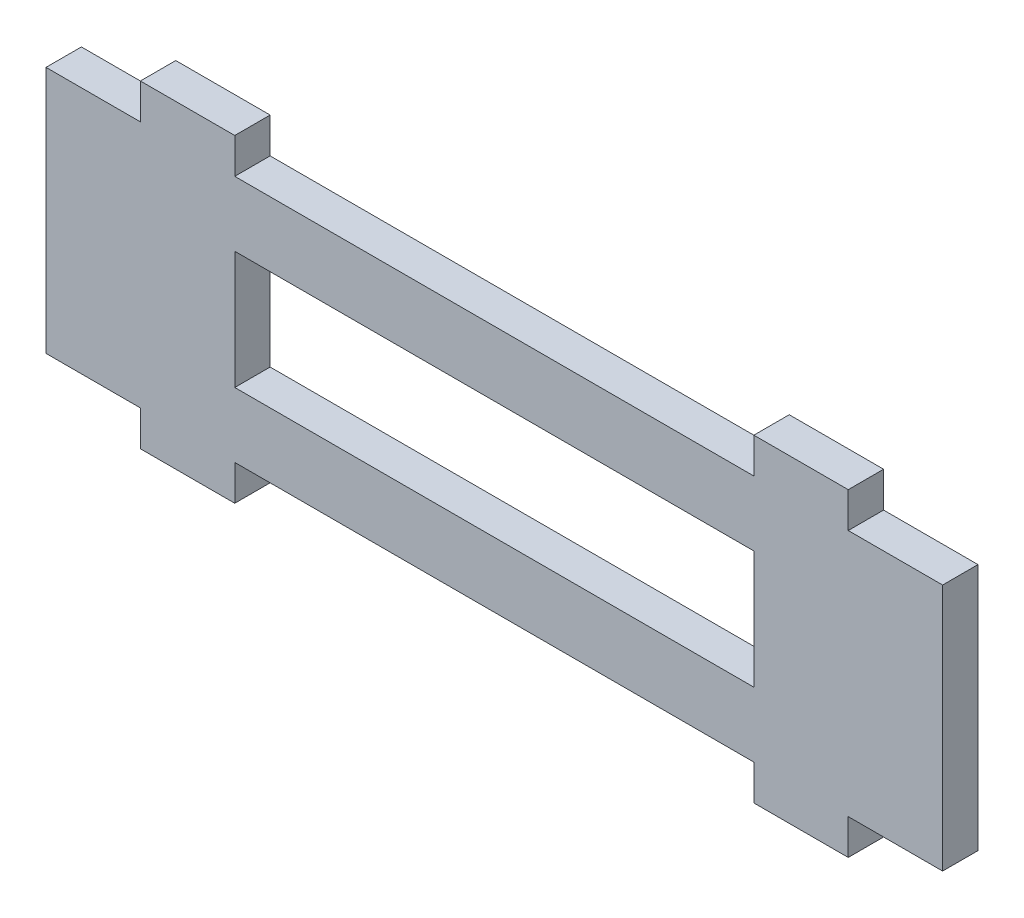
ISO-10303-21;
HEADER;
FILE_DESCRIPTION(('STEP AP214'),'2;1');
FILE_NAME('part.step','',(''),(''),'','','');
FILE_SCHEMA(('AUTOMOTIVE_DESIGN { 1 0 10303 214 1 1 1 1 }'));
ENDSEC;
DATA;
#1=APPLICATION_CONTEXT('core data for automotive mechanical design processes');
#2=APPLICATION_PROTOCOL_DEFINITION('international standard','automotive_design',2000,#1);
#3=PRODUCT_CONTEXT('',#1,'mechanical');
#4=PRODUCT('Part','Part','',(#3));
#5=PRODUCT_RELATED_PRODUCT_CATEGORY('part','',(#4));
#6=PRODUCT_DEFINITION_FORMATION('','',#4);
#7=PRODUCT_DEFINITION_CONTEXT('part definition',#1,'design');
#8=PRODUCT_DEFINITION('design','',#6,#7);
#9=PRODUCT_DEFINITION_SHAPE('','',#8);
#10=(LENGTH_UNIT() NAMED_UNIT(*) SI_UNIT(.MILLI.,.METRE.));
#11=(NAMED_UNIT(*) PLANE_ANGLE_UNIT() SI_UNIT($,.RADIAN.));
#12=(NAMED_UNIT(*) SI_UNIT($,.STERADIAN.) SOLID_ANGLE_UNIT());
#13=UNCERTAINTY_MEASURE_WITH_UNIT(LENGTH_MEASURE(1.E-05),#10,'distance_accuracy_value','');
#14=(GEOMETRIC_REPRESENTATION_CONTEXT(3) GLOBAL_UNCERTAINTY_ASSIGNED_CONTEXT((#13)) GLOBAL_UNIT_ASSIGNED_CONTEXT((#10,
#11,#12)) REPRESENTATION_CONTEXT('',''));
#15=CARTESIAN_POINT('',(0.,0.,0.));
#16=DIRECTION('',(0.,0.,1.));
#17=DIRECTION('',(1.,0.,0.));
#18=AXIS2_PLACEMENT_3D('',#15,#16,#17);
#19=CARTESIAN_POINT('',(0.,0.,3.));
#20=DIRECTION('',(0.,0.,1.));
#21=DIRECTION('',(1.,0.,0.));
#22=AXIS2_PLACEMENT_3D('',#19,#20,#21);
#23=PLANE('',#22);
#24=DIRECTION('',(0.,-1.,0.));
#25=VECTOR('',#24,1.);
#26=CARTESIAN_POINT('',(22.,13.5,3.));
#27=LINE('',#26,#25);
#28=CARTESIAN_POINT('',(22.,13.5,3.));
#29=VERTEX_POINT('',#28);
#30=CARTESIAN_POINT('',(22.,10.5,3.));
#31=VERTEX_POINT('',#30);
#32=EDGE_CURVE('E230',#29,#31,#27,.T.);
#33=ORIENTED_EDGE('',*,*,#32,.T.);
#34=DIRECTION('',(-1.,0.,0.));
#35=VECTOR('',#34,1.);
#36=CARTESIAN_POINT('',(-22.,10.5,3.));
#37=LINE('',#36,#35);
#38=CARTESIAN_POINT('',(-22.,10.5,3.));
#39=VERTEX_POINT('',#38);
#40=EDGE_CURVE('E233',#31,#39,#37,.T.);
#41=ORIENTED_EDGE('',*,*,#40,.T.);
#42=DIRECTION('',(0.,1.,0.));
#43=VECTOR('',#42,1.);
#44=CARTESIAN_POINT('',(-22.,13.5,3.));
#45=LINE('',#44,#43);
#46=CARTESIAN_POINT('',(-22.,13.5,3.));
#47=VERTEX_POINT('',#46);
#48=EDGE_CURVE('E236',#39,#47,#45,.T.);
#49=ORIENTED_EDGE('',*,*,#48,.T.);
#50=DIRECTION('',(-1.,0.,0.));
#51=VECTOR('',#50,1.);
#52=CARTESIAN_POINT('',(-30.,13.5,3.));
#53=LINE('',#52,#51);
#54=CARTESIAN_POINT('',(-30.,13.5,3.));
#55=VERTEX_POINT('',#54);
#56=EDGE_CURVE('E238',#47,#55,#53,.T.);
#57=ORIENTED_EDGE('',*,*,#56,.T.);
#58=DIRECTION('',(0.,-1.,0.));
#59=VECTOR('',#58,1.);
#60=CARTESIAN_POINT('',(-30.,10.5,3.));
#61=LINE('',#60,#59);
#62=CARTESIAN_POINT('',(-30.,10.5,3.));
#63=VERTEX_POINT('',#62);
#64=EDGE_CURVE('E240',#55,#63,#61,.T.);
#65=ORIENTED_EDGE('',*,*,#64,.T.);
#66=DIRECTION('',(-1.,0.,0.));
#67=VECTOR('',#66,1.);
#68=CARTESIAN_POINT('',(-38.,10.5,3.));
#69=LINE('',#68,#67);
#70=CARTESIAN_POINT('',(-38.,10.5,3.));
#71=VERTEX_POINT('',#70);
#72=EDGE_CURVE('E242',#63,#71,#69,.T.);
#73=ORIENTED_EDGE('',*,*,#72,.T.);
#74=DIRECTION('',(0.,-1.,0.));
#75=VECTOR('',#74,1.);
#76=CARTESIAN_POINT('',(-38.,-10.5,3.));
#77=LINE('',#76,#75);
#78=CARTESIAN_POINT('',(-38.,-10.5,3.));
#79=VERTEX_POINT('',#78);
#80=EDGE_CURVE('E244',#71,#79,#77,.T.);
#81=ORIENTED_EDGE('',*,*,#80,.T.);
#82=DIRECTION('',(1.,0.,0.));
#83=VECTOR('',#82,1.);
#84=CARTESIAN_POINT('',(-38.,-10.5,3.));
#85=LINE('',#84,#83);
#86=CARTESIAN_POINT('',(-30.,-10.5,3.));
#87=VERTEX_POINT('',#86);
#88=EDGE_CURVE('E246',#79,#87,#85,.T.);
#89=ORIENTED_EDGE('',*,*,#88,.T.);
#90=DIRECTION('',(0.,-1.,0.));
#91=VECTOR('',#90,1.);
#92=CARTESIAN_POINT('',(-30.,-10.5,3.));
#93=LINE('',#92,#91);
#94=CARTESIAN_POINT('',(-30.,-13.5,3.));
#95=VERTEX_POINT('',#94);
#96=EDGE_CURVE('E248',#87,#95,#93,.T.);
#97=ORIENTED_EDGE('',*,*,#96,.T.);
#98=DIRECTION('',(1.,0.,0.));
#99=VECTOR('',#98,1.);
#100=CARTESIAN_POINT('',(-30.,-13.5,3.));
#101=LINE('',#100,#99);
#102=CARTESIAN_POINT('',(-22.,-13.5,3.));
#103=VERTEX_POINT('',#102);
#104=EDGE_CURVE('E250',#95,#103,#101,.T.);
#105=ORIENTED_EDGE('',*,*,#104,.T.);
#106=DIRECTION('',(0.,1.,0.));
#107=VECTOR('',#106,1.);
#108=CARTESIAN_POINT('',(-22.,-13.5,3.));
#109=LINE('',#108,#107);
#110=CARTESIAN_POINT('',(-22.,-10.5,3.));
#111=VERTEX_POINT('',#110);
#112=EDGE_CURVE('E252',#103,#111,#109,.T.);
#113=ORIENTED_EDGE('',*,*,#112,.T.);
#114=DIRECTION('',(1.,0.,0.));
#115=VECTOR('',#114,1.);
#116=CARTESIAN_POINT('',(-22.,-10.5,3.));
#117=LINE('',#116,#115);
#118=CARTESIAN_POINT('',(22.,-10.5,3.));
#119=VERTEX_POINT('',#118);
#120=EDGE_CURVE('E254',#111,#119,#117,.T.);
#121=ORIENTED_EDGE('',*,*,#120,.T.);
#122=DIRECTION('',(0.,-1.,0.));
#123=VECTOR('',#122,1.);
#124=CARTESIAN_POINT('',(22.,-13.5,3.));
#125=LINE('',#124,#123);
#126=CARTESIAN_POINT('',(22.,-13.5,3.));
#127=VERTEX_POINT('',#126);
#128=EDGE_CURVE('E256',#119,#127,#125,.T.);
#129=ORIENTED_EDGE('',*,*,#128,.T.);
#130=DIRECTION('',(1.,0.,0.));
#131=VECTOR('',#130,1.);
#132=CARTESIAN_POINT('',(30.,-13.5,3.));
#133=LINE('',#132,#131);
#134=CARTESIAN_POINT('',(30.,-13.5,3.));
#135=VERTEX_POINT('',#134);
#136=EDGE_CURVE('E258',#127,#135,#133,.T.);
#137=ORIENTED_EDGE('',*,*,#136,.T.);
#138=DIRECTION('',(0.,1.,0.));
#139=VECTOR('',#138,1.);
#140=CARTESIAN_POINT('',(30.,-10.5,3.));
#141=LINE('',#140,#139);
#142=CARTESIAN_POINT('',(30.,-10.5,3.));
#143=VERTEX_POINT('',#142);
#144=EDGE_CURVE('E260',#135,#143,#141,.T.);
#145=ORIENTED_EDGE('',*,*,#144,.T.);
#146=DIRECTION('',(1.,0.,0.));
#147=VECTOR('',#146,1.);
#148=CARTESIAN_POINT('',(38.,-10.5,3.));
#149=LINE('',#148,#147);
#150=CARTESIAN_POINT('',(38.,-10.5,3.));
#151=VERTEX_POINT('',#150);
#152=EDGE_CURVE('E262',#143,#151,#149,.T.);
#153=ORIENTED_EDGE('',*,*,#152,.T.);
#154=DIRECTION('',(0.,1.,0.));
#155=VECTOR('',#154,1.);
#156=CARTESIAN_POINT('',(38.,-10.5,3.));
#157=LINE('',#156,#155);
#158=CARTESIAN_POINT('',(38.,10.5,3.));
#159=VERTEX_POINT('',#158);
#160=EDGE_CURVE('E264',#151,#159,#157,.T.);
#161=ORIENTED_EDGE('',*,*,#160,.T.);
#162=DIRECTION('',(-1.,0.,0.));
#163=VECTOR('',#162,1.);
#164=CARTESIAN_POINT('',(38.,10.5,3.));
#165=LINE('',#164,#163);
#166=CARTESIAN_POINT('',(30.,10.5,3.));
#167=VERTEX_POINT('',#166);
#168=EDGE_CURVE('E266',#159,#167,#165,.T.);
#169=ORIENTED_EDGE('',*,*,#168,.T.);
#170=DIRECTION('',(0.,1.,0.));
#171=VECTOR('',#170,1.);
#172=CARTESIAN_POINT('',(30.,10.5,3.));
#173=LINE('',#172,#171);
#174=CARTESIAN_POINT('',(30.,13.5,3.));
#175=VERTEX_POINT('',#174);
#176=EDGE_CURVE('E268',#167,#175,#173,.T.);
#177=ORIENTED_EDGE('',*,*,#176,.T.);
#178=DIRECTION('',(-1.,0.,0.));
#179=VECTOR('',#178,1.);
#180=CARTESIAN_POINT('',(30.,13.5,3.));
#181=LINE('',#180,#179);
#182=EDGE_CURVE('E270',#175,#29,#181,.T.);
#183=ORIENTED_EDGE('',*,*,#182,.T.);
#184=EDGE_LOOP('',(#33,#41,#49,#57,#65,#73,#81,#89,#97,#105,#113,#121,#129,#137,#145,#153,#161,
#169,#177,#183));
#185=FACE_BOUND('',#184,.T.);
#186=DIRECTION('',(-1.,0.,0.));
#187=VECTOR('',#186,1.);
#188=CARTESIAN_POINT('',(-22.,5.,3.));
#189=LINE('',#188,#187);
#190=CARTESIAN_POINT('',(22.,5.,3.));
#191=VERTEX_POINT('',#190);
#192=CARTESIAN_POINT('',(-22.,5.,3.));
#193=VERTEX_POINT('',#192);
#194=EDGE_CURVE('E202',#191,#193,#189,.T.);
#195=ORIENTED_EDGE('',*,*,#194,.F.);
#196=DIRECTION('',(0.,1.,0.));
#197=VECTOR('',#196,1.);
#198=CARTESIAN_POINT('',(22.,-5.,3.));
#199=LINE('',#198,#197);
#200=CARTESIAN_POINT('',(22.,-5.,3.));
#201=VERTEX_POINT('',#200);
#202=EDGE_CURVE('E194',#201,#191,#199,.T.);
#203=ORIENTED_EDGE('',*,*,#202,.F.);
#204=DIRECTION('',(1.,0.,0.));
#205=VECTOR('',#204,1.);
#206=CARTESIAN_POINT('',(-22.,-5.,3.));
#207=LINE('',#206,#205);
#208=CARTESIAN_POINT('',(-22.,-5.,3.));
#209=VERTEX_POINT('',#208);
#210=EDGE_CURVE('E216',#209,#201,#207,.T.);
#211=ORIENTED_EDGE('',*,*,#210,.F.);
#212=DIRECTION('',(0.,-1.,0.));
#213=VECTOR('',#212,1.);
#214=CARTESIAN_POINT('',(-22.,-5.,3.));
#215=LINE('',#214,#213);
#216=EDGE_CURVE('E214',#193,#209,#215,.T.);
#217=ORIENTED_EDGE('',*,*,#216,.F.);
#218=EDGE_LOOP('',(#195,#203,#211,#217));
#219=FACE_BOUND('',#218,.T.);
#220=ADVANCED_FACE('F33',(#185,#219),#23,.T.);
#221=CARTESIAN_POINT('',(0.,0.,0.));
#222=DIRECTION('',(0.,0.,1.));
#223=DIRECTION('',(1.,0.,0.));
#224=AXIS2_PLACEMENT_3D('',#221,#222,#223);
#225=PLANE('',#224);
#226=DIRECTION('',(0.,-1.,0.));
#227=VECTOR('',#226,1.);
#228=CARTESIAN_POINT('',(22.,13.5,0.));
#229=LINE('',#228,#227);
#230=CARTESIAN_POINT('',(22.,13.5,0.));
#231=VERTEX_POINT('',#230);
#232=CARTESIAN_POINT('',(22.,10.5,0.));
#233=VERTEX_POINT('',#232);
#234=EDGE_CURVE('E210',#231,#233,#229,.T.);
#235=ORIENTED_EDGE('',*,*,#234,.F.);
#236=DIRECTION('',(-1.,0.,0.));
#237=VECTOR('',#236,1.);
#238=CARTESIAN_POINT('',(30.,13.5,0.));
#239=LINE('',#238,#237);
#240=CARTESIAN_POINT('',(30.,13.5,0.));
#241=VERTEX_POINT('',#240);
#242=EDGE_CURVE('E234',#241,#231,#239,.T.);
#243=ORIENTED_EDGE('',*,*,#242,.F.);
#244=DIRECTION('',(0.,1.,0.));
#245=VECTOR('',#244,1.);
#246=CARTESIAN_POINT('',(30.,10.5,0.));
#247=LINE('',#246,#245);
#248=CARTESIAN_POINT('',(30.,10.5,0.));
#249=VERTEX_POINT('',#248);
#250=EDGE_CURVE('E309',#249,#241,#247,.T.);
#251=ORIENTED_EDGE('',*,*,#250,.F.);
#252=DIRECTION('',(-1.,0.,0.));
#253=VECTOR('',#252,1.);
#254=CARTESIAN_POINT('',(38.,10.5,0.));
#255=LINE('',#254,#253);
#256=CARTESIAN_POINT('',(38.,10.5,0.));
#257=VERTEX_POINT('',#256);
#258=EDGE_CURVE('E307',#257,#249,#255,.T.);
#259=ORIENTED_EDGE('',*,*,#258,.F.);
#260=DIRECTION('',(0.,1.,0.));
#261=VECTOR('',#260,1.);
#262=CARTESIAN_POINT('',(38.,-10.5,0.));
#263=LINE('',#262,#261);
#264=CARTESIAN_POINT('',(38.,-10.5,0.));
#265=VERTEX_POINT('',#264);
#266=EDGE_CURVE('E305',#265,#257,#263,.T.);
#267=ORIENTED_EDGE('',*,*,#266,.F.);
#268=DIRECTION('',(1.,0.,0.));
#269=VECTOR('',#268,1.);
#270=CARTESIAN_POINT('',(38.,-10.5,0.));
#271=LINE('',#270,#269);
#272=CARTESIAN_POINT('',(30.,-10.5,0.));
#273=VERTEX_POINT('',#272);
#274=EDGE_CURVE('E303',#273,#265,#271,.T.);
#275=ORIENTED_EDGE('',*,*,#274,.F.);
#276=DIRECTION('',(0.,1.,0.));
#277=VECTOR('',#276,1.);
#278=CARTESIAN_POINT('',(30.,-10.5,0.));
#279=LINE('',#278,#277);
#280=CARTESIAN_POINT('',(30.,-13.5,0.));
#281=VERTEX_POINT('',#280);
#282=EDGE_CURVE('E301',#281,#273,#279,.T.);
#283=ORIENTED_EDGE('',*,*,#282,.F.);
#284=DIRECTION('',(1.,0.,0.));
#285=VECTOR('',#284,1.);
#286=CARTESIAN_POINT('',(30.,-13.5,0.));
#287=LINE('',#286,#285);
#288=CARTESIAN_POINT('',(22.,-13.5,0.));
#289=VERTEX_POINT('',#288);
#290=EDGE_CURVE('E299',#289,#281,#287,.T.);
#291=ORIENTED_EDGE('',*,*,#290,.F.);
#292=DIRECTION('',(0.,-1.,0.));
#293=VECTOR('',#292,1.);
#294=CARTESIAN_POINT('',(22.,-13.5,0.));
#295=LINE('',#294,#293);
#296=CARTESIAN_POINT('',(22.,-10.5,0.));
#297=VERTEX_POINT('',#296);
#298=EDGE_CURVE('E297',#297,#289,#295,.T.);
#299=ORIENTED_EDGE('',*,*,#298,.F.);
#300=DIRECTION('',(1.,0.,0.));
#301=VECTOR('',#300,1.);
#302=CARTESIAN_POINT('',(-22.,-10.5,0.));
#303=LINE('',#302,#301);
#304=CARTESIAN_POINT('',(-22.,-10.5,0.));
#305=VERTEX_POINT('',#304);
#306=EDGE_CURVE('E295',#305,#297,#303,.T.);
#307=ORIENTED_EDGE('',*,*,#306,.F.);
#308=DIRECTION('',(0.,1.,0.));
#309=VECTOR('',#308,1.);
#310=CARTESIAN_POINT('',(-22.,-13.5,0.));
#311=LINE('',#310,#309);
#312=CARTESIAN_POINT('',(-22.,-13.5,0.));
#313=VERTEX_POINT('',#312);
#314=EDGE_CURVE('E293',#313,#305,#311,.T.);
#315=ORIENTED_EDGE('',*,*,#314,.F.);
#316=DIRECTION('',(1.,0.,0.));
#317=VECTOR('',#316,1.);
#318=CARTESIAN_POINT('',(-30.,-13.5,0.));
#319=LINE('',#318,#317);
#320=CARTESIAN_POINT('',(-30.,-13.5,0.));
#321=VERTEX_POINT('',#320);
#322=EDGE_CURVE('E291',#321,#313,#319,.T.);
#323=ORIENTED_EDGE('',*,*,#322,.F.);
#324=DIRECTION('',(0.,-1.,0.));
#325=VECTOR('',#324,1.);
#326=CARTESIAN_POINT('',(-30.,-10.5,0.));
#327=LINE('',#326,#325);
#328=CARTESIAN_POINT('',(-30.,-10.5,0.));
#329=VERTEX_POINT('',#328);
#330=EDGE_CURVE('E289',#329,#321,#327,.T.);
#331=ORIENTED_EDGE('',*,*,#330,.F.);
#332=DIRECTION('',(1.,0.,0.));
#333=VECTOR('',#332,1.);
#334=CARTESIAN_POINT('',(-38.,-10.5,0.));
#335=LINE('',#334,#333);
#336=CARTESIAN_POINT('',(-38.,-10.5,0.));
#337=VERTEX_POINT('',#336);
#338=EDGE_CURVE('E287',#337,#329,#335,.T.);
#339=ORIENTED_EDGE('',*,*,#338,.F.);
#340=DIRECTION('',(0.,-1.,0.));
#341=VECTOR('',#340,1.);
#342=CARTESIAN_POINT('',(-38.,-10.5,0.));
#343=LINE('',#342,#341);
#344=CARTESIAN_POINT('',(-38.,10.5,0.));
#345=VERTEX_POINT('',#344);
#346=EDGE_CURVE('E285',#345,#337,#343,.T.);
#347=ORIENTED_EDGE('',*,*,#346,.F.);
#348=DIRECTION('',(-1.,0.,0.));
#349=VECTOR('',#348,1.);
#350=CARTESIAN_POINT('',(-38.,10.5,0.));
#351=LINE('',#350,#349);
#352=CARTESIAN_POINT('',(-30.,10.5,0.));
#353=VERTEX_POINT('',#352);
#354=EDGE_CURVE('E283',#353,#345,#351,.T.);
#355=ORIENTED_EDGE('',*,*,#354,.F.);
#356=DIRECTION('',(0.,-1.,0.));
#357=VECTOR('',#356,1.);
#358=CARTESIAN_POINT('',(-30.,10.5,0.));
#359=LINE('',#358,#357);
#360=CARTESIAN_POINT('',(-30.,13.5,0.));
#361=VERTEX_POINT('',#360);
#362=EDGE_CURVE('E281',#361,#353,#359,.T.);
#363=ORIENTED_EDGE('',*,*,#362,.F.);
#364=DIRECTION('',(-1.,0.,0.));
#365=VECTOR('',#364,1.);
#366=CARTESIAN_POINT('',(-30.,13.5,0.));
#367=LINE('',#366,#365);
#368=CARTESIAN_POINT('',(-22.,13.5,0.));
#369=VERTEX_POINT('',#368);
#370=EDGE_CURVE('E279',#369,#361,#367,.T.);
#371=ORIENTED_EDGE('',*,*,#370,.F.);
#372=DIRECTION('',(0.,1.,0.));
#373=VECTOR('',#372,1.);
#374=CARTESIAN_POINT('',(-22.,13.5,0.));
#375=LINE('',#374,#373);
#376=CARTESIAN_POINT('',(-22.,10.5,0.));
#377=VERTEX_POINT('',#376);
#378=EDGE_CURVE('E277',#377,#369,#375,.T.);
#379=ORIENTED_EDGE('',*,*,#378,.F.);
#380=DIRECTION('',(-1.,0.,0.));
#381=VECTOR('',#380,1.);
#382=CARTESIAN_POINT('',(-22.,10.5,0.));
#383=LINE('',#382,#381);
#384=EDGE_CURVE('E275',#233,#377,#383,.T.);
#385=ORIENTED_EDGE('',*,*,#384,.F.);
#386=EDGE_LOOP('',(#235,#243,#251,#259,#267,#275,#283,#291,#299,#307,#315,#323,#331,#339,#347,
#355,#363,#371,#379,#385));
#387=FACE_BOUND('',#386,.T.);
#388=DIRECTION('',(0.,1.,0.));
#389=VECTOR('',#388,1.);
#390=CARTESIAN_POINT('',(22.,-5.,0.));
#391=LINE('',#390,#389);
#392=CARTESIAN_POINT('',(22.,-5.,0.));
#393=VERTEX_POINT('',#392);
#394=CARTESIAN_POINT('',(22.,5.,0.));
#395=VERTEX_POINT('',#394);
#396=EDGE_CURVE('E56',#393,#395,#391,.T.);
#397=ORIENTED_EDGE('',*,*,#396,.T.);
#398=DIRECTION('',(-1.,0.,0.));
#399=VECTOR('',#398,1.);
#400=CARTESIAN_POINT('',(-22.,5.,0.));
#401=LINE('',#400,#399);
#402=CARTESIAN_POINT('',(-22.,5.,0.));
#403=VERTEX_POINT('',#402);
#404=EDGE_CURVE('E209',#395,#403,#401,.T.);
#405=ORIENTED_EDGE('',*,*,#404,.T.);
#406=DIRECTION('',(0.,-1.,0.));
#407=VECTOR('',#406,1.);
#408=CARTESIAN_POINT('',(-22.,-5.,0.));
#409=LINE('',#408,#407);
#410=CARTESIAN_POINT('',(-22.,-5.,0.));
#411=VERTEX_POINT('',#410);
#412=EDGE_CURVE('E222',#403,#411,#409,.T.);
#413=ORIENTED_EDGE('',*,*,#412,.T.);
#414=DIRECTION('',(1.,0.,0.));
#415=VECTOR('',#414,1.);
#416=CARTESIAN_POINT('',(-22.,-5.,0.));
#417=LINE('',#416,#415);
#418=EDGE_CURVE('E203',#411,#393,#417,.T.);
#419=ORIENTED_EDGE('',*,*,#418,.T.);
#420=EDGE_LOOP('',(#397,#405,#413,#419));
#421=FACE_BOUND('',#420,.T.);
#422=ADVANCED_FACE('F375',(#387,#421),#225,.F.);
#423=CARTESIAN_POINT('',(22.,13.5,3.));
#424=DIRECTION('',(1.,0.,0.));
#425=DIRECTION('',(0.,1.,0.));
#426=AXIS2_PLACEMENT_3D('',#423,#424,#425);
#427=PLANE('',#426);
#428=ORIENTED_EDGE('',*,*,#234,.T.);
#429=DIRECTION('',(0.,0.,-1.));
#430=VECTOR('',#429,1.);
#431=CARTESIAN_POINT('',(22.,10.5,3.));
#432=LINE('',#431,#430);
#433=EDGE_CURVE('E11',#31,#233,#432,.T.);
#434=ORIENTED_EDGE('',*,*,#433,.F.);
#435=ORIENTED_EDGE('',*,*,#32,.F.);
#436=DIRECTION('',(0.,0.,-1.));
#437=VECTOR('',#436,1.);
#438=CARTESIAN_POINT('',(22.,13.5,3.));
#439=LINE('',#438,#437);
#440=EDGE_CURVE('E272',#29,#231,#439,.T.);
#441=ORIENTED_EDGE('',*,*,#440,.T.);
#442=EDGE_LOOP('',(#428,#434,#435,#441));
#443=FACE_BOUND('',#442,.T.);
#444=ADVANCED_FACE('F35',(#443),#427,.F.);
#445=CARTESIAN_POINT('',(-22.,10.5,3.));
#446=DIRECTION('',(0.,-1.,0.));
#447=DIRECTION('',(0.,0.,-1.));
#448=AXIS2_PLACEMENT_3D('',#445,#446,#447);
#449=PLANE('',#448);
#450=ORIENTED_EDGE('',*,*,#384,.T.);
#451=DIRECTION('',(0.,0.,-1.));
#452=VECTOR('',#451,1.);
#453=CARTESIAN_POINT('',(-22.,10.5,3.));
#454=LINE('',#453,#452);
#455=EDGE_CURVE('E41',#39,#377,#454,.T.);
#456=ORIENTED_EDGE('',*,*,#455,.F.);
#457=ORIENTED_EDGE('',*,*,#40,.F.);
#458=ORIENTED_EDGE('',*,*,#433,.T.);
#459=EDGE_LOOP('',(#450,#456,#457,#458));
#460=FACE_BOUND('',#459,.T.);
#461=ADVANCED_FACE('F392',(#460),#449,.F.);
#462=CARTESIAN_POINT('',(-22.,13.5,3.));
#463=DIRECTION('',(-1.,0.,0.));
#464=DIRECTION('',(0.,-1.,0.));
#465=AXIS2_PLACEMENT_3D('',#462,#463,#464);
#466=PLANE('',#465);
#467=ORIENTED_EDGE('',*,*,#378,.T.);
#468=DIRECTION('',(0.,0.,-1.));
#469=VECTOR('',#468,1.);
#470=CARTESIAN_POINT('',(-22.,13.5,3.));
#471=LINE('',#470,#469);
#472=EDGE_CURVE('E362',#47,#369,#471,.T.);
#473=ORIENTED_EDGE('',*,*,#472,.F.);
#474=ORIENTED_EDGE('',*,*,#48,.F.);
#475=ORIENTED_EDGE('',*,*,#455,.T.);
#476=EDGE_LOOP('',(#467,#473,#474,#475));
#477=FACE_BOUND('',#476,.T.);
#478=ADVANCED_FACE('F369',(#477),#466,.F.);
#479=CARTESIAN_POINT('',(-30.,13.5,3.));
#480=DIRECTION('',(0.,-1.,0.));
#481=DIRECTION('',(0.,0.,-1.));
#482=AXIS2_PLACEMENT_3D('',#479,#480,#481);
#483=PLANE('',#482);
#484=ORIENTED_EDGE('',*,*,#370,.T.);
#485=DIRECTION('',(0.,0.,-1.));
#486=VECTOR('',#485,1.);
#487=CARTESIAN_POINT('',(-30.,13.5,3.));
#488=LINE('',#487,#486);
#489=EDGE_CURVE('E359',#55,#361,#488,.T.);
#490=ORIENTED_EDGE('',*,*,#489,.F.);
#491=ORIENTED_EDGE('',*,*,#56,.F.);
#492=ORIENTED_EDGE('',*,*,#472,.T.);
#493=EDGE_LOOP('',(#484,#490,#491,#492));
#494=FACE_BOUND('',#493,.T.);
#495=ADVANCED_FACE('F381',(#494),#483,.F.);
#496=CARTESIAN_POINT('',(-30.,10.5,3.));
#497=DIRECTION('',(1.,0.,0.));
#498=DIRECTION('',(0.,1.,0.));
#499=AXIS2_PLACEMENT_3D('',#496,#497,#498);
#500=PLANE('',#499);
#501=ORIENTED_EDGE('',*,*,#362,.T.);
#502=DIRECTION('',(0.,0.,-1.));
#503=VECTOR('',#502,1.);
#504=CARTESIAN_POINT('',(-30.,10.5,3.));
#505=LINE('',#504,#503);
#506=EDGE_CURVE('E356',#63,#353,#505,.T.);
#507=ORIENTED_EDGE('',*,*,#506,.F.);
#508=ORIENTED_EDGE('',*,*,#64,.F.);
#509=ORIENTED_EDGE('',*,*,#489,.T.);
#510=EDGE_LOOP('',(#501,#507,#508,#509));
#511=FACE_BOUND('',#510,.T.);
#512=ADVANCED_FACE('F385',(#511),#500,.F.);
#513=CARTESIAN_POINT('',(-38.,10.5,3.));
#514=DIRECTION('',(0.,-1.,0.));
#515=DIRECTION('',(0.,0.,-1.));
#516=AXIS2_PLACEMENT_3D('',#513,#514,#515);
#517=PLANE('',#516);
#518=ORIENTED_EDGE('',*,*,#354,.T.);
#519=DIRECTION('',(0.,0.,-1.));
#520=VECTOR('',#519,1.);
#521=CARTESIAN_POINT('',(-38.,10.5,3.));
#522=LINE('',#521,#520);
#523=EDGE_CURVE('E353',#71,#345,#522,.T.);
#524=ORIENTED_EDGE('',*,*,#523,.F.);
#525=ORIENTED_EDGE('',*,*,#72,.F.);
#526=ORIENTED_EDGE('',*,*,#506,.T.);
#527=EDGE_LOOP('',(#518,#524,#525,#526));
#528=FACE_BOUND('',#527,.T.);
#529=ADVANCED_FACE('F465',(#528),#517,.F.);
#530=CARTESIAN_POINT('',(-38.,-10.5,3.));
#531=DIRECTION('',(1.,0.,0.));
#532=DIRECTION('',(0.,0.,-1.));
#533=AXIS2_PLACEMENT_3D('',#530,#531,#532);
#534=PLANE('',#533);
#535=ORIENTED_EDGE('',*,*,#346,.T.);
#536=DIRECTION('',(0.,0.,-1.));
#537=VECTOR('',#536,1.);
#538=CARTESIAN_POINT('',(-38.,-10.5,3.));
#539=LINE('',#538,#537);
#540=EDGE_CURVE('E350',#79,#337,#539,.T.);
#541=ORIENTED_EDGE('',*,*,#540,.F.);
#542=ORIENTED_EDGE('',*,*,#80,.F.);
#543=ORIENTED_EDGE('',*,*,#523,.T.);
#544=EDGE_LOOP('',(#535,#541,#542,#543));
#545=FACE_BOUND('',#544,.T.);
#546=ADVANCED_FACE('F463',(#545),#534,.F.);
#547=CARTESIAN_POINT('',(-38.,-10.5,3.));
#548=DIRECTION('',(0.,1.,0.));
#549=DIRECTION('',(0.,0.,1.));
#550=AXIS2_PLACEMENT_3D('',#547,#548,#549);
#551=PLANE('',#550);
#552=ORIENTED_EDGE('',*,*,#338,.T.);
#553=DIRECTION('',(0.,0.,-1.));
#554=VECTOR('',#553,1.);
#555=CARTESIAN_POINT('',(-30.,-10.5,3.));
#556=LINE('',#555,#554);
#557=EDGE_CURVE('E347',#87,#329,#556,.T.);
#558=ORIENTED_EDGE('',*,*,#557,.F.);
#559=ORIENTED_EDGE('',*,*,#88,.F.);
#560=ORIENTED_EDGE('',*,*,#540,.T.);
#561=EDGE_LOOP('',(#552,#558,#559,#560));
#562=FACE_BOUND('',#561,.T.);
#563=ADVANCED_FACE('F458',(#562),#551,.F.);
#564=CARTESIAN_POINT('',(-30.,-10.5,3.));
#565=DIRECTION('',(1.,0.,0.));
#566=DIRECTION('',(0.,1.,0.));
#567=AXIS2_PLACEMENT_3D('',#564,#565,#566);
#568=PLANE('',#567);
#569=ORIENTED_EDGE('',*,*,#330,.T.);
#570=DIRECTION('',(0.,0.,-1.));
#571=VECTOR('',#570,1.);
#572=CARTESIAN_POINT('',(-30.,-13.5,3.));
#573=LINE('',#572,#571);
#574=EDGE_CURVE('E344',#95,#321,#573,.T.);
#575=ORIENTED_EDGE('',*,*,#574,.F.);
#576=ORIENTED_EDGE('',*,*,#96,.F.);
#577=ORIENTED_EDGE('',*,*,#557,.T.);
#578=EDGE_LOOP('',(#569,#575,#576,#577));
#579=FACE_BOUND('',#578,.T.);
#580=ADVANCED_FACE('F453',(#579),#568,.F.);
#581=CARTESIAN_POINT('',(-30.,-13.5,3.));
#582=DIRECTION('',(0.,1.,0.));
#583=DIRECTION('',(0.,0.,1.));
#584=AXIS2_PLACEMENT_3D('',#581,#582,#583);
#585=PLANE('',#584);
#586=ORIENTED_EDGE('',*,*,#322,.T.);
#587=DIRECTION('',(0.,0.,-1.));
#588=VECTOR('',#587,1.);
#589=CARTESIAN_POINT('',(-22.,-13.5,3.));
#590=LINE('',#589,#588);
#591=EDGE_CURVE('E341',#103,#313,#590,.T.);
#592=ORIENTED_EDGE('',*,*,#591,.F.);
#593=ORIENTED_EDGE('',*,*,#104,.F.);
#594=ORIENTED_EDGE('',*,*,#574,.T.);
#595=EDGE_LOOP('',(#586,#592,#593,#594));
#596=FACE_BOUND('',#595,.T.);
#597=ADVANCED_FACE('F449',(#596),#585,.F.);
#598=CARTESIAN_POINT('',(-22.,-13.5,3.));
#599=DIRECTION('',(-1.,0.,0.));
#600=DIRECTION('',(0.,-1.,0.));
#601=AXIS2_PLACEMENT_3D('',#598,#599,#600);
#602=PLANE('',#601);
#603=ORIENTED_EDGE('',*,*,#314,.T.);
#604=DIRECTION('',(0.,0.,-1.));
#605=VECTOR('',#604,1.);
#606=CARTESIAN_POINT('',(-22.,-10.5,3.));
#607=LINE('',#606,#605);
#608=EDGE_CURVE('E338',#111,#305,#607,.T.);
#609=ORIENTED_EDGE('',*,*,#608,.F.);
#610=ORIENTED_EDGE('',*,*,#112,.F.);
#611=ORIENTED_EDGE('',*,*,#591,.T.);
#612=EDGE_LOOP('',(#603,#609,#610,#611));
#613=FACE_BOUND('',#612,.T.);
#614=ADVANCED_FACE('F444',(#613),#602,.F.);
#615=CARTESIAN_POINT('',(-22.,-10.5,3.));
#616=DIRECTION('',(0.,1.,0.));
#617=DIRECTION('',(0.,0.,1.));
#618=AXIS2_PLACEMENT_3D('',#615,#616,#617);
#619=PLANE('',#618);
#620=ORIENTED_EDGE('',*,*,#306,.T.);
#621=DIRECTION('',(0.,0.,-1.));
#622=VECTOR('',#621,1.);
#623=CARTESIAN_POINT('',(22.,-10.5,3.));
#624=LINE('',#623,#622);
#625=EDGE_CURVE('E335',#119,#297,#624,.T.);
#626=ORIENTED_EDGE('',*,*,#625,.F.);
#627=ORIENTED_EDGE('',*,*,#120,.F.);
#628=ORIENTED_EDGE('',*,*,#608,.T.);
#629=EDGE_LOOP('',(#620,#626,#627,#628));
#630=FACE_BOUND('',#629,.T.);
#631=ADVANCED_FACE('F438',(#630),#619,.F.);
#632=CARTESIAN_POINT('',(22.,-13.5,3.));
#633=DIRECTION('',(1.,0.,0.));
#634=DIRECTION('',(0.,1.,0.));
#635=AXIS2_PLACEMENT_3D('',#632,#633,#634);
#636=PLANE('',#635);
#637=ORIENTED_EDGE('',*,*,#298,.T.);
#638=DIRECTION('',(0.,0.,-1.));
#639=VECTOR('',#638,1.);
#640=CARTESIAN_POINT('',(22.,-13.5,3.));
#641=LINE('',#640,#639);
#642=EDGE_CURVE('E332',#127,#289,#641,.T.);
#643=ORIENTED_EDGE('',*,*,#642,.F.);
#644=ORIENTED_EDGE('',*,*,#128,.F.);
#645=ORIENTED_EDGE('',*,*,#625,.T.);
#646=EDGE_LOOP('',(#637,#643,#644,#645));
#647=FACE_BOUND('',#646,.T.);
#648=ADVANCED_FACE('F434',(#647),#636,.F.);
#649=CARTESIAN_POINT('',(30.,-13.5,3.));
#650=DIRECTION('',(0.,1.,0.));
#651=DIRECTION('',(0.,0.,1.));
#652=AXIS2_PLACEMENT_3D('',#649,#650,#651);
#653=PLANE('',#652);
#654=ORIENTED_EDGE('',*,*,#290,.T.);
#655=DIRECTION('',(0.,0.,-1.));
#656=VECTOR('',#655,1.);
#657=CARTESIAN_POINT('',(30.,-13.5,3.));
#658=LINE('',#657,#656);
#659=EDGE_CURVE('E329',#135,#281,#658,.T.);
#660=ORIENTED_EDGE('',*,*,#659,.F.);
#661=ORIENTED_EDGE('',*,*,#136,.F.);
#662=ORIENTED_EDGE('',*,*,#642,.T.);
#663=EDGE_LOOP('',(#654,#660,#661,#662));
#664=FACE_BOUND('',#663,.T.);
#665=ADVANCED_FACE('F429',(#664),#653,.F.);
#666=CARTESIAN_POINT('',(30.,-10.5,3.));
#667=DIRECTION('',(-1.,0.,0.));
#668=DIRECTION('',(0.,-1.,0.));
#669=AXIS2_PLACEMENT_3D('',#666,#667,#668);
#670=PLANE('',#669);
#671=ORIENTED_EDGE('',*,*,#282,.T.);
#672=DIRECTION('',(0.,0.,-1.));
#673=VECTOR('',#672,1.);
#674=CARTESIAN_POINT('',(30.,-10.5,3.));
#675=LINE('',#674,#673);
#676=EDGE_CURVE('E326',#143,#273,#675,.T.);
#677=ORIENTED_EDGE('',*,*,#676,.F.);
#678=ORIENTED_EDGE('',*,*,#144,.F.);
#679=ORIENTED_EDGE('',*,*,#659,.T.);
#680=EDGE_LOOP('',(#671,#677,#678,#679));
#681=FACE_BOUND('',#680,.T.);
#682=ADVANCED_FACE('F423',(#681),#670,.F.);
#683=CARTESIAN_POINT('',(38.,-10.5,3.));
#684=DIRECTION('',(0.,1.,0.));
#685=DIRECTION('',(0.,0.,1.));
#686=AXIS2_PLACEMENT_3D('',#683,#684,#685);
#687=PLANE('',#686);
#688=ORIENTED_EDGE('',*,*,#274,.T.);
#689=DIRECTION('',(0.,0.,-1.));
#690=VECTOR('',#689,1.);
#691=CARTESIAN_POINT('',(38.,-10.5,3.));
#692=LINE('',#691,#690);
#693=EDGE_CURVE('E323',#151,#265,#692,.T.);
#694=ORIENTED_EDGE('',*,*,#693,.F.);
#695=ORIENTED_EDGE('',*,*,#152,.F.);
#696=ORIENTED_EDGE('',*,*,#676,.T.);
#697=EDGE_LOOP('',(#688,#694,#695,#696));
#698=FACE_BOUND('',#697,.T.);
#699=ADVANCED_FACE('F419',(#698),#687,.F.);
#700=CARTESIAN_POINT('',(38.,-10.5,3.));
#701=DIRECTION('',(-1.,0.,0.));
#702=DIRECTION('',(0.,0.,1.));
#703=AXIS2_PLACEMENT_3D('',#700,#701,#702);
#704=PLANE('',#703);
#705=ORIENTED_EDGE('',*,*,#266,.T.);
#706=DIRECTION('',(0.,0.,-1.));
#707=VECTOR('',#706,1.);
#708=CARTESIAN_POINT('',(38.,10.5,3.));
#709=LINE('',#708,#707);
#710=EDGE_CURVE('E320',#159,#257,#709,.T.);
#711=ORIENTED_EDGE('',*,*,#710,.F.);
#712=ORIENTED_EDGE('',*,*,#160,.F.);
#713=ORIENTED_EDGE('',*,*,#693,.T.);
#714=EDGE_LOOP('',(#705,#711,#712,#713));
#715=FACE_BOUND('',#714,.T.);
#716=ADVANCED_FACE('F414',(#715),#704,.F.);
#717=CARTESIAN_POINT('',(38.,10.5,3.));
#718=DIRECTION('',(0.,-1.,0.));
#719=DIRECTION('',(0.,0.,-1.));
#720=AXIS2_PLACEMENT_3D('',#717,#718,#719);
#721=PLANE('',#720);
#722=ORIENTED_EDGE('',*,*,#258,.T.);
#723=DIRECTION('',(0.,0.,-1.));
#724=VECTOR('',#723,1.);
#725=CARTESIAN_POINT('',(30.,10.5,3.));
#726=LINE('',#725,#724);
#727=EDGE_CURVE('E317',#167,#249,#726,.T.);
#728=ORIENTED_EDGE('',*,*,#727,.F.);
#729=ORIENTED_EDGE('',*,*,#168,.F.);
#730=ORIENTED_EDGE('',*,*,#710,.T.);
#731=EDGE_LOOP('',(#722,#728,#729,#730));
#732=FACE_BOUND('',#731,.T.);
#733=ADVANCED_FACE('F408',(#732),#721,.F.);
#734=CARTESIAN_POINT('',(30.,10.5,3.));
#735=DIRECTION('',(-1.,0.,0.));
#736=DIRECTION('',(0.,-1.,0.));
#737=AXIS2_PLACEMENT_3D('',#734,#735,#736);
#738=PLANE('',#737);
#739=ORIENTED_EDGE('',*,*,#250,.T.);
#740=DIRECTION('',(0.,0.,-1.));
#741=VECTOR('',#740,1.);
#742=CARTESIAN_POINT('',(30.,13.5,3.));
#743=LINE('',#742,#741);
#744=EDGE_CURVE('E314',#175,#241,#743,.T.);
#745=ORIENTED_EDGE('',*,*,#744,.F.);
#746=ORIENTED_EDGE('',*,*,#176,.F.);
#747=ORIENTED_EDGE('',*,*,#727,.T.);
#748=EDGE_LOOP('',(#739,#745,#746,#747));
#749=FACE_BOUND('',#748,.T.);
#750=ADVANCED_FACE('F404',(#749),#738,.F.);
#751=CARTESIAN_POINT('',(30.,13.5,3.));
#752=DIRECTION('',(0.,-1.,0.));
#753=DIRECTION('',(0.,0.,-1.));
#754=AXIS2_PLACEMENT_3D('',#751,#752,#753);
#755=PLANE('',#754);
#756=ORIENTED_EDGE('',*,*,#242,.T.);
#757=ORIENTED_EDGE('',*,*,#440,.F.);
#758=ORIENTED_EDGE('',*,*,#182,.F.);
#759=ORIENTED_EDGE('',*,*,#744,.T.);
#760=EDGE_LOOP('',(#756,#757,#758,#759));
#761=FACE_BOUND('',#760,.T.);
#762=ADVANCED_FACE('F399',(#761),#755,.F.);
#763=CARTESIAN_POINT('',(22.,-5.,3.));
#764=DIRECTION('',(-1.,0.,0.));
#765=DIRECTION('',(0.,0.,1.));
#766=AXIS2_PLACEMENT_3D('',#763,#764,#765);
#767=PLANE('',#766);
#768=ORIENTED_EDGE('',*,*,#396,.F.);
#769=DIRECTION('',(0.,0.,-1.));
#770=VECTOR('',#769,1.);
#771=CARTESIAN_POINT('',(22.,-5.,3.));
#772=LINE('',#771,#770);
#773=EDGE_CURVE('E198',#201,#393,#772,.T.);
#774=ORIENTED_EDGE('',*,*,#773,.F.);
#775=ORIENTED_EDGE('',*,*,#202,.T.);
#776=DIRECTION('',(0.,0.,-1.));
#777=VECTOR('',#776,1.);
#778=CARTESIAN_POINT('',(22.,5.,3.));
#779=LINE('',#778,#777);
#780=EDGE_CURVE('E197',#191,#395,#779,.T.);
#781=ORIENTED_EDGE('',*,*,#780,.T.);
#782=EDGE_LOOP('',(#768,#774,#775,#781));
#783=FACE_BOUND('',#782,.T.);
#784=ADVANCED_FACE('F196',(#783),#767,.T.);
#785=CARTESIAN_POINT('',(-22.,5.,3.));
#786=DIRECTION('',(0.,-1.,0.));
#787=DIRECTION('',(0.,0.,-1.));
#788=AXIS2_PLACEMENT_3D('',#785,#786,#787);
#789=PLANE('',#788);
#790=ORIENTED_EDGE('',*,*,#404,.F.);
#791=ORIENTED_EDGE('',*,*,#780,.F.);
#792=ORIENTED_EDGE('',*,*,#194,.T.);
#793=DIRECTION('',(0.,0.,-1.));
#794=VECTOR('',#793,1.);
#795=CARTESIAN_POINT('',(-22.,5.,3.));
#796=LINE('',#795,#794);
#797=EDGE_CURVE('E211',#193,#403,#796,.T.);
#798=ORIENTED_EDGE('',*,*,#797,.T.);
#799=EDGE_LOOP('',(#790,#791,#792,#798));
#800=FACE_BOUND('',#799,.T.);
#801=ADVANCED_FACE('F206',(#800),#789,.T.);
#802=CARTESIAN_POINT('',(-22.,-5.,3.));
#803=DIRECTION('',(1.,0.,0.));
#804=DIRECTION('',(0.,0.,-1.));
#805=AXIS2_PLACEMENT_3D('',#802,#803,#804);
#806=PLANE('',#805);
#807=ORIENTED_EDGE('',*,*,#412,.F.);
#808=ORIENTED_EDGE('',*,*,#797,.F.);
#809=ORIENTED_EDGE('',*,*,#216,.T.);
#810=DIRECTION('',(0.,0.,-1.));
#811=VECTOR('',#810,1.);
#812=CARTESIAN_POINT('',(-22.,-5.,3.));
#813=LINE('',#812,#811);
#814=EDGE_CURVE('E48',#209,#411,#813,.T.);
#815=ORIENTED_EDGE('',*,*,#814,.T.);
#816=EDGE_LOOP('',(#807,#808,#809,#815));
#817=FACE_BOUND('',#816,.T.);
#818=ADVANCED_FACE('F571',(#817),#806,.T.);
#819=CARTESIAN_POINT('',(-22.,-5.,3.));
#820=DIRECTION('',(0.,1.,0.));
#821=DIRECTION('',(0.,0.,1.));
#822=AXIS2_PLACEMENT_3D('',#819,#820,#821);
#823=PLANE('',#822);
#824=ORIENTED_EDGE('',*,*,#418,.F.);
#825=ORIENTED_EDGE('',*,*,#814,.F.);
#826=ORIENTED_EDGE('',*,*,#210,.T.);
#827=ORIENTED_EDGE('',*,*,#773,.T.);
#828=EDGE_LOOP('',(#824,#825,#826,#827));
#829=FACE_BOUND('',#828,.T.);
#830=ADVANCED_FACE('F577',(#829),#823,.T.);
#831=CLOSED_SHELL('',(#220,#422,#444,#461,#478,#495,#512,#529,#546,#563,#580,#597,#614,#631,
#648,#665,#682,#699,#716,#733,#750,#762,#784,#801,#818,#830));
#832=MANIFOLD_SOLID_BREP('B2',#831);
#833=ADVANCED_BREP_SHAPE_REPRESENTATION('',(#18,#832),#14);
#834=SHAPE_DEFINITION_REPRESENTATION(#9,#833);
ENDSEC;
END-ISO-10303-21;
